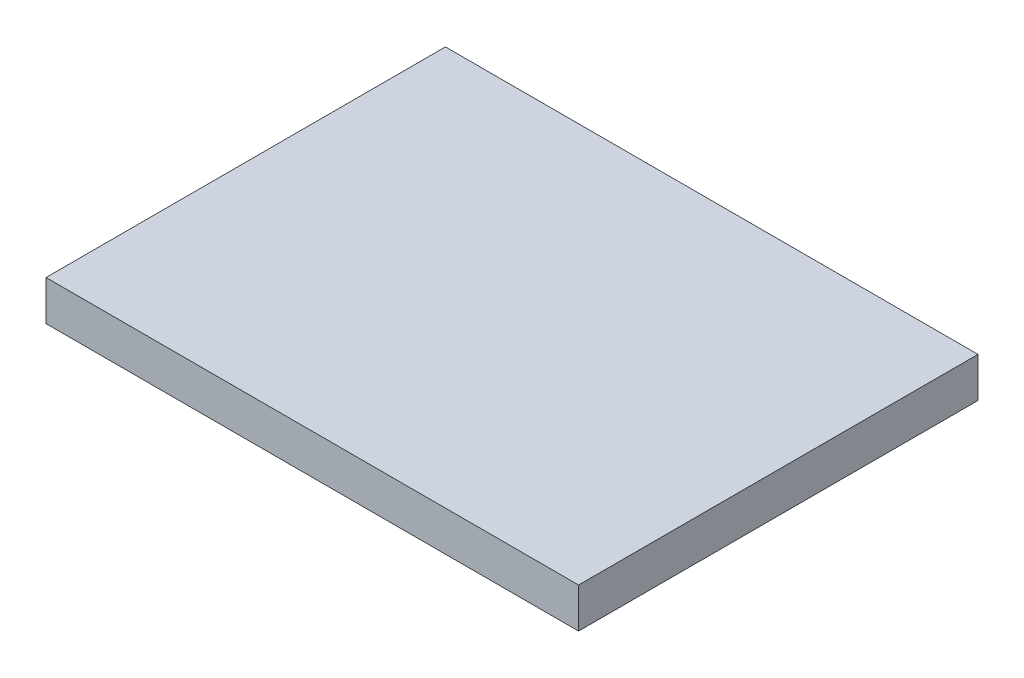
ISO-10303-21;
HEADER;
FILE_DESCRIPTION(('STEP AP214'),'2;1');
FILE_NAME('part.step','',(''),(''),'','','');
FILE_SCHEMA(('AUTOMOTIVE_DESIGN { 1 0 10303 214 1 1 1 1 }'));
ENDSEC;
DATA;
#1=APPLICATION_CONTEXT('core data for automotive mechanical design processes');
#2=APPLICATION_PROTOCOL_DEFINITION('international standard','automotive_design',2000,#1);
#3=PRODUCT_CONTEXT('',#1,'mechanical');
#4=PRODUCT('Part','Part','',(#3));
#5=PRODUCT_RELATED_PRODUCT_CATEGORY('part','',(#4));
#6=PRODUCT_DEFINITION_FORMATION('','',#4);
#7=PRODUCT_DEFINITION_CONTEXT('part definition',#1,'design');
#8=PRODUCT_DEFINITION('design','',#6,#7);
#9=PRODUCT_DEFINITION_SHAPE('','',#8);
#10=(LENGTH_UNIT() NAMED_UNIT(*) SI_UNIT(.MILLI.,.METRE.));
#11=(NAMED_UNIT(*) PLANE_ANGLE_UNIT() SI_UNIT($,.RADIAN.));
#12=(NAMED_UNIT(*) SI_UNIT($,.STERADIAN.) SOLID_ANGLE_UNIT());
#13=UNCERTAINTY_MEASURE_WITH_UNIT(LENGTH_MEASURE(1.E-05),#10,'distance_accuracy_value','');
#14=(GEOMETRIC_REPRESENTATION_CONTEXT(3) GLOBAL_UNCERTAINTY_ASSIGNED_CONTEXT((#13)) GLOBAL_UNIT_ASSIGNED_CONTEXT((#10,
#11,#12)) REPRESENTATION_CONTEXT('',''));
#15=CARTESIAN_POINT('',(0.,0.,0.));
#16=DIRECTION('',(0.,0.,1.));
#17=DIRECTION('',(1.,0.,0.));
#18=AXIS2_PLACEMENT_3D('',#15,#16,#17);
#19=CARTESIAN_POINT('',(20.,1.5,-15.));
#20=DIRECTION('',(-1.,0.,0.));
#21=DIRECTION('',(0.,0.,1.));
#22=AXIS2_PLACEMENT_3D('',#19,#20,#21);
#23=PLANE('',#22);
#24=DIRECTION('',(0.,0.,-1.));
#25=VECTOR('',#24,1.);
#26=CARTESIAN_POINT('',(20.,-1.5,-15.));
#27=LINE('',#26,#25);
#28=CARTESIAN_POINT('',(20.,-1.5,15.));
#29=VERTEX_POINT('',#28);
#30=CARTESIAN_POINT('',(20.,-1.5,-15.));
#31=VERTEX_POINT('',#30);
#32=EDGE_CURVE('E107',#29,#31,#27,.T.);
#33=ORIENTED_EDGE('',*,*,#32,.T.);
#34=DIRECTION('',(0.,-1.,0.));
#35=VECTOR('',#34,1.);
#36=CARTESIAN_POINT('',(20.,1.5,-15.));
#37=LINE('',#36,#35);
#38=CARTESIAN_POINT('',(20.,1.5,-15.));
#39=VERTEX_POINT('',#38);
#40=EDGE_CURVE('E11',#39,#31,#37,.T.);
#41=ORIENTED_EDGE('',*,*,#40,.F.);
#42=DIRECTION('',(0.,0.,-1.));
#43=VECTOR('',#42,1.);
#44=CARTESIAN_POINT('',(20.,1.5,-15.));
#45=LINE('',#44,#43);
#46=CARTESIAN_POINT('',(20.,1.5,15.));
#47=VERTEX_POINT('',#46);
#48=EDGE_CURVE('E91',#47,#39,#45,.T.);
#49=ORIENTED_EDGE('',*,*,#48,.F.);
#50=DIRECTION('',(0.,-1.,0.));
#51=VECTOR('',#50,1.);
#52=CARTESIAN_POINT('',(20.,1.5,15.));
#53=LINE('',#52,#51);
#54=EDGE_CURVE('E103',#47,#29,#53,.T.);
#55=ORIENTED_EDGE('',*,*,#54,.T.);
#56=EDGE_LOOP('',(#33,#41,#49,#55));
#57=FACE_BOUND('',#56,.T.);
#58=ADVANCED_FACE('F39',(#57),#23,.F.);
#59=CARTESIAN_POINT('',(-20.,1.5,-15.));
#60=DIRECTION('',(0.,0.,1.));
#61=DIRECTION('',(1.,0.,0.));
#62=AXIS2_PLACEMENT_3D('',#59,#60,#61);
#63=PLANE('',#62);
#64=DIRECTION('',(-1.,0.,0.));
#65=VECTOR('',#64,1.);
#66=CARTESIAN_POINT('',(-20.,-1.5,-15.));
#67=LINE('',#66,#65);
#68=CARTESIAN_POINT('',(-20.,-1.5,-15.));
#69=VERTEX_POINT('',#68);
#70=EDGE_CURVE('E96',#31,#69,#67,.T.);
#71=ORIENTED_EDGE('',*,*,#70,.T.);
#72=DIRECTION('',(0.,-1.,0.));
#73=VECTOR('',#72,1.);
#74=CARTESIAN_POINT('',(-20.,1.5,-15.));
#75=LINE('',#74,#73);
#76=CARTESIAN_POINT('',(-20.,1.5,-15.));
#77=VERTEX_POINT('',#76);
#78=EDGE_CURVE('E48',#77,#69,#75,.T.);
#79=ORIENTED_EDGE('',*,*,#78,.F.);
#80=DIRECTION('',(-1.,0.,0.));
#81=VECTOR('',#80,1.);
#82=CARTESIAN_POINT('',(-20.,1.5,-15.));
#83=LINE('',#82,#81);
#84=EDGE_CURVE('E86',#39,#77,#83,.T.);
#85=ORIENTED_EDGE('',*,*,#84,.F.);
#86=ORIENTED_EDGE('',*,*,#40,.T.);
#87=EDGE_LOOP('',(#71,#79,#85,#86));
#88=FACE_BOUND('',#87,.T.);
#89=ADVANCED_FACE('F95',(#88),#63,.F.);
#90=CARTESIAN_POINT('',(-20.,1.5,-15.));
#91=DIRECTION('',(1.,0.,0.));
#92=DIRECTION('',(0.,0.,-1.));
#93=AXIS2_PLACEMENT_3D('',#90,#91,#92);
#94=PLANE('',#93);
#95=DIRECTION('',(0.,0.,1.));
#96=VECTOR('',#95,1.);
#97=CARTESIAN_POINT('',(-20.,-1.5,-15.));
#98=LINE('',#97,#96);
#99=CARTESIAN_POINT('',(-20.,-1.5,15.));
#100=VERTEX_POINT('',#99);
#101=EDGE_CURVE('E73',#69,#100,#98,.T.);
#102=ORIENTED_EDGE('',*,*,#101,.T.);
#103=DIRECTION('',(0.,-1.,0.));
#104=VECTOR('',#103,1.);
#105=CARTESIAN_POINT('',(-20.,1.5,15.));
#106=LINE('',#105,#104);
#107=CARTESIAN_POINT('',(-20.,1.5,15.));
#108=VERTEX_POINT('',#107);
#109=EDGE_CURVE('E98',#108,#100,#106,.T.);
#110=ORIENTED_EDGE('',*,*,#109,.F.);
#111=DIRECTION('',(0.,0.,1.));
#112=VECTOR('',#111,1.);
#113=CARTESIAN_POINT('',(-20.,1.5,-15.));
#114=LINE('',#113,#112);
#115=EDGE_CURVE('E89',#77,#108,#114,.T.);
#116=ORIENTED_EDGE('',*,*,#115,.F.);
#117=ORIENTED_EDGE('',*,*,#78,.T.);
#118=EDGE_LOOP('',(#102,#110,#116,#117));
#119=FACE_BOUND('',#118,.T.);
#120=ADVANCED_FACE('F99',(#119),#94,.F.);
#121=CARTESIAN_POINT('',(-20.,1.5,15.));
#122=DIRECTION('',(0.,0.,-1.));
#123=DIRECTION('',(-1.,0.,0.));
#124=AXIS2_PLACEMENT_3D('',#121,#122,#123);
#125=PLANE('',#124);
#126=DIRECTION('',(1.,0.,0.));
#127=VECTOR('',#126,1.);
#128=CARTESIAN_POINT('',(-20.,-1.5,15.));
#129=LINE('',#128,#127);
#130=EDGE_CURVE('E79',#100,#29,#129,.T.);
#131=ORIENTED_EDGE('',*,*,#130,.T.);
#132=ORIENTED_EDGE('',*,*,#54,.F.);
#133=DIRECTION('',(1.,0.,0.));
#134=VECTOR('',#133,1.);
#135=CARTESIAN_POINT('',(-20.,1.5,15.));
#136=LINE('',#135,#134);
#137=EDGE_CURVE('E56',#108,#47,#136,.T.);
#138=ORIENTED_EDGE('',*,*,#137,.F.);
#139=ORIENTED_EDGE('',*,*,#109,.T.);
#140=EDGE_LOOP('',(#131,#132,#138,#139));
#141=FACE_BOUND('',#140,.T.);
#142=ADVANCED_FACE('F120',(#141),#125,.F.);
#143=CARTESIAN_POINT('',(0.,1.5,0.));
#144=DIRECTION('',(0.,1.,0.));
#145=DIRECTION('',(0.,0.,1.));
#146=AXIS2_PLACEMENT_3D('',#143,#144,#145);
#147=PLANE('',#146);
#148=ORIENTED_EDGE('',*,*,#48,.T.);
#149=ORIENTED_EDGE('',*,*,#84,.T.);
#150=ORIENTED_EDGE('',*,*,#115,.T.);
#151=ORIENTED_EDGE('',*,*,#137,.T.);
#152=EDGE_LOOP('',(#148,#149,#150,#151));
#153=FACE_BOUND('',#152,.T.);
#154=ADVANCED_FACE('F87',(#153),#147,.T.);
#155=CARTESIAN_POINT('',(0.,-1.5,0.));
#156=DIRECTION('',(0.,1.,0.));
#157=DIRECTION('',(0.,0.,1.));
#158=AXIS2_PLACEMENT_3D('',#155,#156,#157);
#159=PLANE('',#158);
#160=ORIENTED_EDGE('',*,*,#32,.F.);
#161=ORIENTED_EDGE('',*,*,#130,.F.);
#162=ORIENTED_EDGE('',*,*,#101,.F.);
#163=ORIENTED_EDGE('',*,*,#70,.F.);
#164=EDGE_LOOP('',(#160,#161,#162,#163));
#165=FACE_BOUND('',#164,.T.);
#166=ADVANCED_FACE('F123',(#165),#159,.F.);
#167=CLOSED_SHELL('',(#58,#89,#120,#142,#154,#166));
#168=MANIFOLD_SOLID_BREP('B2',#167);
#169=ADVANCED_BREP_SHAPE_REPRESENTATION('',(#18,#168),#14);
#170=SHAPE_DEFINITION_REPRESENTATION(#9,#169);
ENDSEC;
END-ISO-10303-21;
